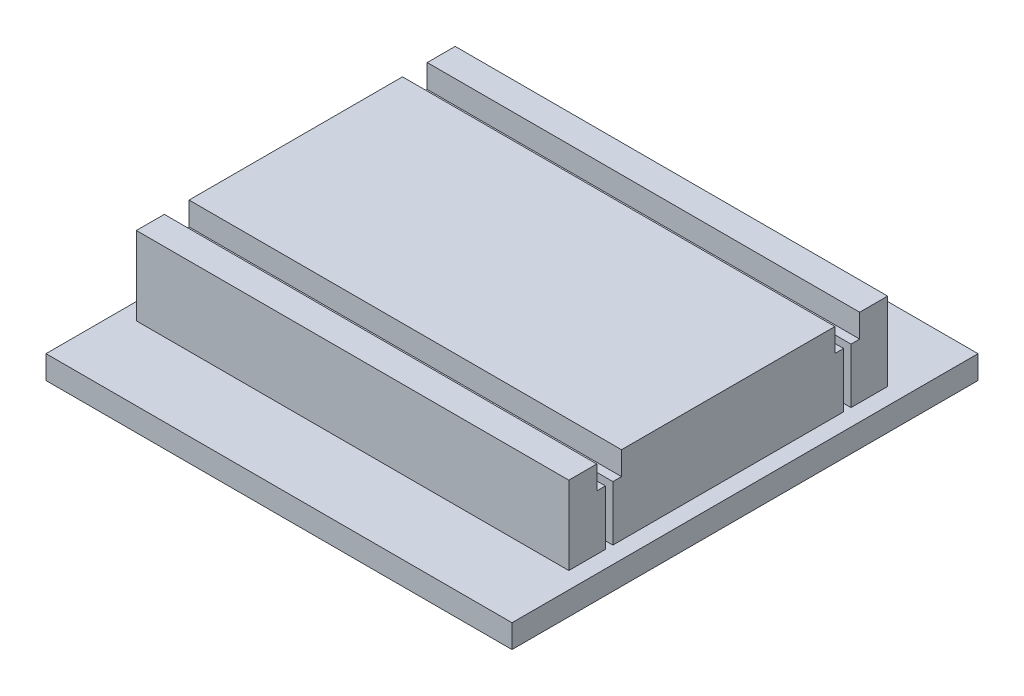
ISO-10303-21;
HEADER;
FILE_DESCRIPTION(('STEP AP214'),'2;1');
FILE_NAME('part.step','',(''),(''),'','','');
FILE_SCHEMA(('AUTOMOTIVE_DESIGN { 1 0 10303 214 1 1 1 1 }'));
ENDSEC;
DATA;
#1=APPLICATION_CONTEXT('core data for automotive mechanical design processes');
#2=APPLICATION_PROTOCOL_DEFINITION('international standard','automotive_design',2000,#1);
#3=PRODUCT_CONTEXT('',#1,'mechanical');
#4=PRODUCT('Part','Part','',(#3));
#5=PRODUCT_RELATED_PRODUCT_CATEGORY('part','',(#4));
#6=PRODUCT_DEFINITION_FORMATION('','',#4);
#7=PRODUCT_DEFINITION_CONTEXT('part definition',#1,'design');
#8=PRODUCT_DEFINITION('design','',#6,#7);
#9=PRODUCT_DEFINITION_SHAPE('','',#8);
#10=(LENGTH_UNIT() NAMED_UNIT(*) SI_UNIT(.MILLI.,.METRE.));
#11=(NAMED_UNIT(*) PLANE_ANGLE_UNIT() SI_UNIT($,.RADIAN.));
#12=(NAMED_UNIT(*) SI_UNIT($,.STERADIAN.) SOLID_ANGLE_UNIT());
#13=UNCERTAINTY_MEASURE_WITH_UNIT(LENGTH_MEASURE(1.E-05),#10,'distance_accuracy_value','');
#14=(GEOMETRIC_REPRESENTATION_CONTEXT(3) GLOBAL_UNCERTAINTY_ASSIGNED_CONTEXT((#13)) GLOBAL_UNIT_ASSIGNED_CONTEXT((#10,
#11,#12)) REPRESENTATION_CONTEXT('',''));
#15=CARTESIAN_POINT('',(0.,0.,0.));
#16=DIRECTION('',(0.,0.,1.));
#17=DIRECTION('',(1.,0.,0.));
#18=AXIS2_PLACEMENT_3D('',#15,#16,#17);
#19=CARTESIAN_POINT('',(0.,0.,0.));
#20=DIRECTION('',(0.,-1.,0.));
#21=DIRECTION('',(0.,0.,-1.));
#22=AXIS2_PLACEMENT_3D('',#19,#20,#21);
#23=PLANE('',#22);
#24=DIRECTION('',(0.,0.,-1.));
#25=VECTOR('',#24,1.);
#26=CARTESIAN_POINT('',(-23.2,0.,0.));
#27=LINE('',#26,#25);
#28=CARTESIAN_POINT('',(-23.2,0.,-13.175));
#29=VERTEX_POINT('',#28);
#30=CARTESIAN_POINT('',(-23.2,0.,-17.105));
#31=VERTEX_POINT('',#30);
#32=EDGE_CURVE('E279',#29,#31,#27,.T.);
#33=ORIENTED_EDGE('',*,*,#32,.T.);
#34=DIRECTION('',(-1.,0.,0.));
#35=VECTOR('',#34,1.);
#36=CARTESIAN_POINT('',(-23.2,0.,-17.105));
#37=LINE('',#36,#35);
#38=CARTESIAN_POINT('',(23.2,0.,-17.105));
#39=VERTEX_POINT('',#38);
#40=EDGE_CURVE('E233',#39,#31,#37,.T.);
#41=ORIENTED_EDGE('',*,*,#40,.F.);
#42=DIRECTION('',(0.,0.,-1.));
#43=VECTOR('',#42,1.);
#44=CARTESIAN_POINT('',(23.2,0.,0.));
#45=LINE('',#44,#43);
#46=CARTESIAN_POINT('',(23.2,0.,-13.175));
#47=VERTEX_POINT('',#46);
#48=EDGE_CURVE('E283',#47,#39,#45,.T.);
#49=ORIENTED_EDGE('',*,*,#48,.F.);
#50=DIRECTION('',(-1.,0.,0.));
#51=VECTOR('',#50,1.);
#52=CARTESIAN_POINT('',(0.,0.,-13.175));
#53=LINE('',#52,#51);
#54=EDGE_CURVE('E277',#47,#29,#53,.T.);
#55=ORIENTED_EDGE('',*,*,#54,.T.);
#56=EDGE_LOOP('',(#33,#41,#49,#55));
#57=FACE_BOUND('',#56,.T.);
#58=DIRECTION('',(0.,0.,1.));
#59=VECTOR('',#58,1.);
#60=CARTESIAN_POINT('',(-23.2,0.,12.375));
#61=LINE('',#60,#59);
#62=CARTESIAN_POINT('',(-23.2,0.,-12.375));
#63=VERTEX_POINT('',#62);
#64=CARTESIAN_POINT('',(-23.2,0.,12.375));
#65=VERTEX_POINT('',#64);
#66=EDGE_CURVE('E355',#63,#65,#61,.T.);
#67=ORIENTED_EDGE('',*,*,#66,.F.);
#68=DIRECTION('',(-1.,0.,0.));
#69=VECTOR('',#68,1.);
#70=CARTESIAN_POINT('',(23.2,0.,-12.375));
#71=LINE('',#70,#69);
#72=CARTESIAN_POINT('',(23.2,0.,-12.375));
#73=VERTEX_POINT('',#72);
#74=EDGE_CURVE('E375',#73,#63,#71,.T.);
#75=ORIENTED_EDGE('',*,*,#74,.F.);
#76=DIRECTION('',(0.,0.,-1.));
#77=VECTOR('',#76,1.);
#78=CARTESIAN_POINT('',(23.2,0.,12.375));
#79=LINE('',#78,#77);
#80=CARTESIAN_POINT('',(23.2,0.,12.375));
#81=VERTEX_POINT('',#80);
#82=EDGE_CURVE('E372',#81,#73,#79,.T.);
#83=ORIENTED_EDGE('',*,*,#82,.F.);
#84=DIRECTION('',(1.,0.,0.));
#85=VECTOR('',#84,1.);
#86=CARTESIAN_POINT('',(23.2,0.,12.375));
#87=LINE('',#86,#85);
#88=EDGE_CURVE('E369',#65,#81,#87,.T.);
#89=ORIENTED_EDGE('',*,*,#88,.F.);
#90=EDGE_LOOP('',(#67,#75,#83,#89));
#91=FACE_BOUND('',#90,.T.);
#92=DIRECTION('',(0.,0.,1.));
#93=VECTOR('',#92,1.);
#94=CARTESIAN_POINT('',(25.,0.,25.));
#95=LINE('',#94,#93);
#96=CARTESIAN_POINT('',(25.,0.,-25.));
#97=VERTEX_POINT('',#96);
#98=CARTESIAN_POINT('',(25.,0.,25.));
#99=VERTEX_POINT('',#98);
#100=EDGE_CURVE('E285',#97,#99,#95,.T.);
#101=ORIENTED_EDGE('',*,*,#100,.F.);
#102=DIRECTION('',(1.,0.,0.));
#103=VECTOR('',#102,1.);
#104=CARTESIAN_POINT('',(-25.,0.,-25.));
#105=LINE('',#104,#103);
#106=CARTESIAN_POINT('',(-25.,0.,-25.));
#107=VERTEX_POINT('',#106);
#108=EDGE_CURVE('E303',#107,#97,#105,.T.);
#109=ORIENTED_EDGE('',*,*,#108,.F.);
#110=DIRECTION('',(0.,0.,-1.));
#111=VECTOR('',#110,1.);
#112=CARTESIAN_POINT('',(-25.,0.,25.));
#113=LINE('',#112,#111);
#114=CARTESIAN_POINT('',(-25.,0.,25.));
#115=VERTEX_POINT('',#114);
#116=EDGE_CURVE('E314',#115,#107,#113,.T.);
#117=ORIENTED_EDGE('',*,*,#116,.F.);
#118=DIRECTION('',(-1.,0.,0.));
#119=VECTOR('',#118,1.);
#120=CARTESIAN_POINT('',(-25.,0.,25.));
#121=LINE('',#120,#119);
#122=EDGE_CURVE('E312',#99,#115,#121,.T.);
#123=ORIENTED_EDGE('',*,*,#122,.F.);
#124=EDGE_LOOP('',(#101,#109,#117,#123));
#125=FACE_BOUND('',#124,.T.);
#126=DIRECTION('',(0.,0.,1.));
#127=VECTOR('',#126,1.);
#128=CARTESIAN_POINT('',(23.2,0.,0.));
#129=LINE('',#128,#127);
#130=CARTESIAN_POINT('',(23.2,0.,13.175));
#131=VERTEX_POINT('',#130);
#132=CARTESIAN_POINT('',(23.2,0.,17.105));
#133=VERTEX_POINT('',#132);
#134=EDGE_CURVE('E50',#131,#133,#129,.T.);
#135=ORIENTED_EDGE('',*,*,#134,.T.);
#136=DIRECTION('',(1.,0.,0.));
#137=VECTOR('',#136,1.);
#138=CARTESIAN_POINT('',(23.2,0.,17.105));
#139=LINE('',#138,#137);
#140=CARTESIAN_POINT('',(-23.2,0.,17.105));
#141=VERTEX_POINT('',#140);
#142=EDGE_CURVE('E204',#141,#133,#139,.T.);
#143=ORIENTED_EDGE('',*,*,#142,.F.);
#144=DIRECTION('',(0.,0.,1.));
#145=VECTOR('',#144,1.);
#146=CARTESIAN_POINT('',(-23.2,0.,0.));
#147=LINE('',#146,#145);
#148=CARTESIAN_POINT('',(-23.2,0.,13.175));
#149=VERTEX_POINT('',#148);
#150=EDGE_CURVE('E58',#149,#141,#147,.T.);
#151=ORIENTED_EDGE('',*,*,#150,.F.);
#152=DIRECTION('',(-1.,0.,0.));
#153=VECTOR('',#152,1.);
#154=CARTESIAN_POINT('',(0.,0.,13.175));
#155=LINE('',#154,#153);
#156=EDGE_CURVE('E259',#131,#149,#155,.T.);
#157=ORIENTED_EDGE('',*,*,#156,.F.);
#158=EDGE_LOOP('',(#135,#143,#151,#157));
#159=FACE_BOUND('',#158,.T.);
#160=ADVANCED_FACE('F35',(#57,#91,#125,#159),#23,.F.);
#161=CARTESIAN_POINT('',(0.,5.9,0.));
#162=DIRECTION('',(0.,1.,0.));
#163=DIRECTION('',(0.,0.,1.));
#164=AXIS2_PLACEMENT_3D('',#161,#162,#163);
#165=PLANE('',#164);
#166=DIRECTION('',(0.,0.,-1.));
#167=VECTOR('',#166,1.);
#168=CARTESIAN_POINT('',(23.2,5.9,12.375));
#169=LINE('',#168,#167);
#170=CARTESIAN_POINT('',(23.2,5.9,12.375));
#171=VERTEX_POINT('',#170);
#172=CARTESIAN_POINT('',(23.2,5.9,11.45));
#173=VERTEX_POINT('',#172);
#174=EDGE_CURVE('E362',#171,#173,#169,.T.);
#175=ORIENTED_EDGE('',*,*,#174,.T.);
#176=DIRECTION('',(-1.,0.,0.));
#177=VECTOR('',#176,1.);
#178=CARTESIAN_POINT('',(0.,5.9,11.45));
#179=LINE('',#178,#177);
#180=CARTESIAN_POINT('',(-23.2,5.9,11.45));
#181=VERTEX_POINT('',#180);
#182=EDGE_CURVE('E333',#173,#181,#179,.T.);
#183=ORIENTED_EDGE('',*,*,#182,.T.);
#184=DIRECTION('',(0.,0.,1.));
#185=VECTOR('',#184,1.);
#186=CARTESIAN_POINT('',(-23.2,5.9,12.375));
#187=LINE('',#186,#185);
#188=CARTESIAN_POINT('',(-23.2,5.9,12.375));
#189=VERTEX_POINT('',#188);
#190=EDGE_CURVE('E359',#181,#189,#187,.T.);
#191=ORIENTED_EDGE('',*,*,#190,.T.);
#192=DIRECTION('',(1.,0.,0.));
#193=VECTOR('',#192,1.);
#194=CARTESIAN_POINT('',(23.2,5.9,12.375));
#195=LINE('',#194,#193);
#196=EDGE_CURVE('E358',#189,#171,#195,.T.);
#197=ORIENTED_EDGE('',*,*,#196,.T.);
#198=EDGE_LOOP('',(#175,#183,#191,#197));
#199=FACE_BOUND('',#198,.T.);
#200=ADVANCED_FACE('F418',(#199),#165,.T.);
#201=CARTESIAN_POINT('',(-23.2,5.9,12.375));
#202=DIRECTION('',(1.,0.,0.));
#203=DIRECTION('',(0.,0.,-1.));
#204=AXIS2_PLACEMENT_3D('',#201,#202,#203);
#205=PLANE('',#204);
#206=ORIENTED_EDGE('',*,*,#66,.T.);
#207=DIRECTION('',(0.,-1.,0.));
#208=VECTOR('',#207,1.);
#209=CARTESIAN_POINT('',(-23.2,5.9,12.375));
#210=LINE('',#209,#208);
#211=EDGE_CURVE('E11',#189,#65,#210,.T.);
#212=ORIENTED_EDGE('',*,*,#211,.F.);
#213=ORIENTED_EDGE('',*,*,#190,.F.);
#214=DIRECTION('',(0.,-1.,0.));
#215=VECTOR('',#214,1.);
#216=CARTESIAN_POINT('',(-23.2,8.4,11.45));
#217=LINE('',#216,#215);
#218=CARTESIAN_POINT('',(-23.2,8.4,11.45));
#219=VERTEX_POINT('',#218);
#220=EDGE_CURVE('E346',#219,#181,#217,.T.);
#221=ORIENTED_EDGE('',*,*,#220,.F.);
#222=DIRECTION('',(0.,0.,1.));
#223=VECTOR('',#222,1.);
#224=CARTESIAN_POINT('',(-23.2,8.4,0.));
#225=LINE('',#224,#223);
#226=CARTESIAN_POINT('',(-23.2,8.4,-11.45));
#227=VERTEX_POINT('',#226);
#228=EDGE_CURVE('E335',#227,#219,#225,.T.);
#229=ORIENTED_EDGE('',*,*,#228,.F.);
#230=DIRECTION('',(0.,-1.,0.));
#231=VECTOR('',#230,1.);
#232=CARTESIAN_POINT('',(-23.2,8.4,-11.45));
#233=LINE('',#232,#231);
#234=CARTESIAN_POINT('',(-23.2,5.9,-11.45));
#235=VERTEX_POINT('',#234);
#236=EDGE_CURVE('E349',#227,#235,#233,.T.);
#237=ORIENTED_EDGE('',*,*,#236,.T.);
#238=CARTESIAN_POINT('',(-23.2,5.9,-12.375));
#239=VERTEX_POINT('',#238);
#240=EDGE_CURVE('E356',#239,#235,#187,.T.);
#241=ORIENTED_EDGE('',*,*,#240,.F.);
#242=DIRECTION('',(0.,-1.,0.));
#243=VECTOR('',#242,1.);
#244=CARTESIAN_POINT('',(-23.2,5.9,-12.375));
#245=LINE('',#244,#243);
#246=EDGE_CURVE('E366',#239,#63,#245,.T.);
#247=ORIENTED_EDGE('',*,*,#246,.T.);
#248=EDGE_LOOP('',(#206,#212,#213,#221,#229,#237,#241,#247));
#249=FACE_BOUND('',#248,.T.);
#250=ADVANCED_FACE('F37',(#249),#205,.F.);
#251=CARTESIAN_POINT('',(23.2,5.9,12.375));
#252=DIRECTION('',(0.,0.,-1.));
#253=DIRECTION('',(-1.,0.,0.));
#254=AXIS2_PLACEMENT_3D('',#251,#252,#253);
#255=PLANE('',#254);
#256=ORIENTED_EDGE('',*,*,#88,.T.);
#257=DIRECTION('',(0.,-1.,0.));
#258=VECTOR('',#257,1.);
#259=CARTESIAN_POINT('',(23.2,5.9,12.375));
#260=LINE('',#259,#258);
#261=EDGE_CURVE('E43',#171,#81,#260,.T.);
#262=ORIENTED_EDGE('',*,*,#261,.F.);
#263=ORIENTED_EDGE('',*,*,#196,.F.);
#264=ORIENTED_EDGE('',*,*,#211,.T.);
#265=EDGE_LOOP('',(#256,#262,#263,#264));
#266=FACE_BOUND('',#265,.T.);
#267=ADVANCED_FACE('F390',(#266),#255,.F.);
#268=CARTESIAN_POINT('',(23.2,5.9,12.375));
#269=DIRECTION('',(-1.,0.,0.));
#270=DIRECTION('',(0.,0.,1.));
#271=AXIS2_PLACEMENT_3D('',#268,#269,#270);
#272=PLANE('',#271);
#273=ORIENTED_EDGE('',*,*,#82,.T.);
#274=DIRECTION('',(0.,-1.,0.));
#275=VECTOR('',#274,1.);
#276=CARTESIAN_POINT('',(23.2,5.9,-12.375));
#277=LINE('',#276,#275);
#278=CARTESIAN_POINT('',(23.2,5.9,-12.375));
#279=VERTEX_POINT('',#278);
#280=EDGE_CURVE('E380',#279,#73,#277,.T.);
#281=ORIENTED_EDGE('',*,*,#280,.F.);
#282=CARTESIAN_POINT('',(23.2,5.9,-11.45));
#283=VERTEX_POINT('',#282);
#284=EDGE_CURVE('E361',#283,#279,#169,.T.);
#285=ORIENTED_EDGE('',*,*,#284,.F.);
#286=DIRECTION('',(0.,-1.,0.));
#287=VECTOR('',#286,1.);
#288=CARTESIAN_POINT('',(23.2,8.4,-11.45));
#289=LINE('',#288,#287);
#290=CARTESIAN_POINT('',(23.2,8.4,-11.45));
#291=VERTEX_POINT('',#290);
#292=EDGE_CURVE('E352',#291,#283,#289,.T.);
#293=ORIENTED_EDGE('',*,*,#292,.F.);
#294=DIRECTION('',(0.,0.,-1.));
#295=VECTOR('',#294,1.);
#296=CARTESIAN_POINT('',(23.2,8.4,0.));
#297=LINE('',#296,#295);
#298=CARTESIAN_POINT('',(23.2,8.4,11.45));
#299=VERTEX_POINT('',#298);
#300=EDGE_CURVE('E329',#299,#291,#297,.T.);
#301=ORIENTED_EDGE('',*,*,#300,.F.);
#302=DIRECTION('',(0.,-1.,0.));
#303=VECTOR('',#302,1.);
#304=CARTESIAN_POINT('',(23.2,8.4,11.45));
#305=LINE('',#304,#303);
#306=EDGE_CURVE('E340',#299,#173,#305,.T.);
#307=ORIENTED_EDGE('',*,*,#306,.T.);
#308=ORIENTED_EDGE('',*,*,#174,.F.);
#309=ORIENTED_EDGE('',*,*,#261,.T.);
#310=EDGE_LOOP('',(#273,#281,#285,#293,#301,#307,#308,#309));
#311=FACE_BOUND('',#310,.T.);
#312=ADVANCED_FACE('F386',(#311),#272,.F.);
#313=CARTESIAN_POINT('',(23.2,5.9,-12.375));
#314=DIRECTION('',(0.,0.,1.));
#315=DIRECTION('',(1.,0.,0.));
#316=AXIS2_PLACEMENT_3D('',#313,#314,#315);
#317=PLANE('',#316);
#318=ORIENTED_EDGE('',*,*,#74,.T.);
#319=ORIENTED_EDGE('',*,*,#246,.F.);
#320=DIRECTION('',(-1.,0.,0.));
#321=VECTOR('',#320,1.);
#322=CARTESIAN_POINT('',(23.2,5.9,-12.375));
#323=LINE('',#322,#321);
#324=EDGE_CURVE('E364',#279,#239,#323,.T.);
#325=ORIENTED_EDGE('',*,*,#324,.F.);
#326=ORIENTED_EDGE('',*,*,#280,.T.);
#327=EDGE_LOOP('',(#318,#319,#325,#326));
#328=FACE_BOUND('',#327,.T.);
#329=ADVANCED_FACE('F396',(#328),#317,.F.);
#330=DIRECTION('',(-1.,0.,0.));
#331=VECTOR('',#330,1.);
#332=CARTESIAN_POINT('',(0.,5.9,-11.45));
#333=LINE('',#332,#331);
#334=EDGE_CURVE('E328',#283,#235,#333,.T.);
#335=ORIENTED_EDGE('',*,*,#334,.F.);
#336=ORIENTED_EDGE('',*,*,#284,.T.);
#337=ORIENTED_EDGE('',*,*,#324,.T.);
#338=ORIENTED_EDGE('',*,*,#240,.T.);
#339=EDGE_LOOP('',(#335,#336,#337,#338));
#340=FACE_BOUND('',#339,.T.);
#341=ADVANCED_FACE('F403',(#340),#165,.T.);
#342=CARTESIAN_POINT('',(0.,8.4,-11.45));
#343=DIRECTION('',(0.,0.,1.));
#344=DIRECTION('',(1.,0.,0.));
#345=AXIS2_PLACEMENT_3D('',#342,#343,#344);
#346=PLANE('',#345);
#347=ORIENTED_EDGE('',*,*,#334,.T.);
#348=ORIENTED_EDGE('',*,*,#236,.F.);
#349=DIRECTION('',(-1.,0.,0.));
#350=VECTOR('',#349,1.);
#351=CARTESIAN_POINT('',(0.,8.4,-11.45));
#352=LINE('',#351,#350);
#353=EDGE_CURVE('E332',#291,#227,#352,.T.);
#354=ORIENTED_EDGE('',*,*,#353,.F.);
#355=ORIENTED_EDGE('',*,*,#292,.T.);
#356=EDGE_LOOP('',(#347,#348,#354,#355));
#357=FACE_BOUND('',#356,.T.);
#358=ADVANCED_FACE('F406',(#357),#346,.F.);
#359=CARTESIAN_POINT('',(0.,8.4,11.45));
#360=DIRECTION('',(0.,0.,1.));
#361=DIRECTION('',(1.,0.,0.));
#362=AXIS2_PLACEMENT_3D('',#359,#360,#361);
#363=PLANE('',#362);
#364=ORIENTED_EDGE('',*,*,#182,.F.);
#365=ORIENTED_EDGE('',*,*,#306,.F.);
#366=DIRECTION('',(-1.,0.,0.));
#367=VECTOR('',#366,1.);
#368=CARTESIAN_POINT('',(0.,8.4,11.45));
#369=LINE('',#368,#367);
#370=EDGE_CURVE('E337',#299,#219,#369,.T.);
#371=ORIENTED_EDGE('',*,*,#370,.T.);
#372=ORIENTED_EDGE('',*,*,#220,.T.);
#373=EDGE_LOOP('',(#364,#365,#371,#372));
#374=FACE_BOUND('',#373,.T.);
#375=ADVANCED_FACE('F415',(#374),#363,.T.);
#376=CARTESIAN_POINT('',(0.,8.4,0.));
#377=DIRECTION('',(0.,1.,0.));
#378=DIRECTION('',(0.,0.,1.));
#379=AXIS2_PLACEMENT_3D('',#376,#377,#378);
#380=PLANE('',#379);
#381=ORIENTED_EDGE('',*,*,#300,.T.);
#382=ORIENTED_EDGE('',*,*,#353,.T.);
#383=ORIENTED_EDGE('',*,*,#228,.T.);
#384=ORIENTED_EDGE('',*,*,#370,.F.);
#385=EDGE_LOOP('',(#381,#382,#383,#384));
#386=FACE_BOUND('',#385,.T.);
#387=ADVANCED_FACE('F412',(#386),#380,.T.);
#388=CARTESIAN_POINT('',(25.,-2.5,25.));
#389=DIRECTION('',(-1.,0.,0.));
#390=DIRECTION('',(0.,0.,1.));
#391=AXIS2_PLACEMENT_3D('',#388,#389,#390);
#392=PLANE('',#391);
#393=ORIENTED_EDGE('',*,*,#100,.T.);
#394=DIRECTION('',(0.,1.,0.));
#395=VECTOR('',#394,1.);
#396=CARTESIAN_POINT('',(25.,-2.5,25.));
#397=LINE('',#396,#395);
#398=CARTESIAN_POINT('',(25.,-2.5,25.));
#399=VERTEX_POINT('',#398);
#400=EDGE_CURVE('E325',#399,#99,#397,.T.);
#401=ORIENTED_EDGE('',*,*,#400,.F.);
#402=DIRECTION('',(0.,0.,1.));
#403=VECTOR('',#402,1.);
#404=CARTESIAN_POINT('',(25.,-2.5,25.));
#405=LINE('',#404,#403);
#406=CARTESIAN_POINT('',(25.,-2.5,-25.));
#407=VERTEX_POINT('',#406);
#408=EDGE_CURVE('E299',#407,#399,#405,.T.);
#409=ORIENTED_EDGE('',*,*,#408,.F.);
#410=DIRECTION('',(0.,1.,0.));
#411=VECTOR('',#410,1.);
#412=CARTESIAN_POINT('',(25.,-2.5,-25.));
#413=LINE('',#412,#411);
#414=EDGE_CURVE('E309',#407,#97,#413,.T.);
#415=ORIENTED_EDGE('',*,*,#414,.T.);
#416=EDGE_LOOP('',(#393,#401,#409,#415));
#417=FACE_BOUND('',#416,.T.);
#418=ADVANCED_FACE('F460',(#417),#392,.F.);
#419=CARTESIAN_POINT('',(-25.,-2.5,25.));
#420=DIRECTION('',(0.,0.,-1.));
#421=DIRECTION('',(-1.,0.,0.));
#422=AXIS2_PLACEMENT_3D('',#419,#420,#421);
#423=PLANE('',#422);
#424=ORIENTED_EDGE('',*,*,#122,.T.);
#425=DIRECTION('',(0.,1.,0.));
#426=VECTOR('',#425,1.);
#427=CARTESIAN_POINT('',(-25.,-2.5,25.));
#428=LINE('',#427,#426);
#429=CARTESIAN_POINT('',(-25.,-2.5,25.));
#430=VERTEX_POINT('',#429);
#431=EDGE_CURVE('E322',#430,#115,#428,.T.);
#432=ORIENTED_EDGE('',*,*,#431,.F.);
#433=DIRECTION('',(-1.,0.,0.));
#434=VECTOR('',#433,1.);
#435=CARTESIAN_POINT('',(-25.,-2.5,25.));
#436=LINE('',#435,#434);
#437=EDGE_CURVE('E302',#399,#430,#436,.T.);
#438=ORIENTED_EDGE('',*,*,#437,.F.);
#439=ORIENTED_EDGE('',*,*,#400,.T.);
#440=EDGE_LOOP('',(#424,#432,#438,#439));
#441=FACE_BOUND('',#440,.T.);
#442=ADVANCED_FACE('F465',(#441),#423,.F.);
#443=CARTESIAN_POINT('',(-25.,-2.5,25.));
#444=DIRECTION('',(1.,0.,0.));
#445=DIRECTION('',(0.,0.,-1.));
#446=AXIS2_PLACEMENT_3D('',#443,#444,#445);
#447=PLANE('',#446);
#448=ORIENTED_EDGE('',*,*,#116,.T.);
#449=DIRECTION('',(0.,1.,0.));
#450=VECTOR('',#449,1.);
#451=CARTESIAN_POINT('',(-25.,-2.5,-25.));
#452=LINE('',#451,#450);
#453=CARTESIAN_POINT('',(-25.,-2.5,-25.));
#454=VERTEX_POINT('',#453);
#455=EDGE_CURVE('E319',#454,#107,#452,.T.);
#456=ORIENTED_EDGE('',*,*,#455,.F.);
#457=DIRECTION('',(0.,0.,-1.));
#458=VECTOR('',#457,1.);
#459=CARTESIAN_POINT('',(-25.,-2.5,25.));
#460=LINE('',#459,#458);
#461=EDGE_CURVE('E305',#430,#454,#460,.T.);
#462=ORIENTED_EDGE('',*,*,#461,.F.);
#463=ORIENTED_EDGE('',*,*,#431,.T.);
#464=EDGE_LOOP('',(#448,#456,#462,#463));
#465=FACE_BOUND('',#464,.T.);
#466=ADVANCED_FACE('F477',(#465),#447,.F.);
#467=CARTESIAN_POINT('',(-25.,-2.5,-25.));
#468=DIRECTION('',(0.,0.,1.));
#469=DIRECTION('',(1.,0.,0.));
#470=AXIS2_PLACEMENT_3D('',#467,#468,#469);
#471=PLANE('',#470);
#472=ORIENTED_EDGE('',*,*,#108,.T.);
#473=ORIENTED_EDGE('',*,*,#414,.F.);
#474=DIRECTION('',(1.,0.,0.));
#475=VECTOR('',#474,1.);
#476=CARTESIAN_POINT('',(-25.,-2.5,-25.));
#477=LINE('',#476,#475);
#478=EDGE_CURVE('E307',#454,#407,#477,.T.);
#479=ORIENTED_EDGE('',*,*,#478,.F.);
#480=ORIENTED_EDGE('',*,*,#455,.T.);
#481=EDGE_LOOP('',(#472,#473,#479,#480));
#482=FACE_BOUND('',#481,.T.);
#483=ADVANCED_FACE('F487',(#482),#471,.F.);
#484=CARTESIAN_POINT('',(0.,-2.5,0.));
#485=DIRECTION('',(0.,-1.,0.));
#486=DIRECTION('',(0.,0.,-1.));
#487=AXIS2_PLACEMENT_3D('',#484,#485,#486);
#488=PLANE('',#487);
#489=ORIENTED_EDGE('',*,*,#408,.T.);
#490=ORIENTED_EDGE('',*,*,#437,.T.);
#491=ORIENTED_EDGE('',*,*,#461,.T.);
#492=ORIENTED_EDGE('',*,*,#478,.T.);
#493=EDGE_LOOP('',(#489,#490,#491,#492));
#494=FACE_BOUND('',#493,.T.);
#495=ADVANCED_FACE('F497',(#494),#488,.T.);
#496=CARTESIAN_POINT('',(0.,5.9,0.));
#497=DIRECTION('',(0.,1.,0.));
#498=DIRECTION('',(0.,0.,1.));
#499=AXIS2_PLACEMENT_3D('',#496,#497,#498);
#500=PLANE('',#499);
#501=DIRECTION('',(-1.,0.,0.));
#502=VECTOR('',#501,1.);
#503=CARTESIAN_POINT('',(0.,5.9,-13.175));
#504=LINE('',#503,#502);
#505=CARTESIAN_POINT('',(23.2,5.9,-13.175));
#506=VERTEX_POINT('',#505);
#507=CARTESIAN_POINT('',(-23.2,5.9,-13.175));
#508=VERTEX_POINT('',#507);
#509=EDGE_CURVE('E282',#506,#508,#504,.T.);
#510=ORIENTED_EDGE('',*,*,#509,.F.);
#511=DIRECTION('',(0.,0.,-1.));
#512=VECTOR('',#511,1.);
#513=CARTESIAN_POINT('',(23.2,5.9,0.));
#514=LINE('',#513,#512);
#515=CARTESIAN_POINT('',(23.2,5.9,-14.105));
#516=VERTEX_POINT('',#515);
#517=EDGE_CURVE('E273',#506,#516,#514,.T.);
#518=ORIENTED_EDGE('',*,*,#517,.T.);
#519=DIRECTION('',(-1.,0.,0.));
#520=VECTOR('',#519,1.);
#521=CARTESIAN_POINT('',(0.,5.9,-14.105));
#522=LINE('',#521,#520);
#523=CARTESIAN_POINT('',(-23.2,5.9,-14.105));
#524=VERTEX_POINT('',#523);
#525=EDGE_CURVE('E280',#516,#524,#522,.T.);
#526=ORIENTED_EDGE('',*,*,#525,.T.);
#527=DIRECTION('',(0.,0.,-1.));
#528=VECTOR('',#527,1.);
#529=CARTESIAN_POINT('',(-23.2,5.9,0.));
#530=LINE('',#529,#528);
#531=EDGE_CURVE('E292',#508,#524,#530,.T.);
#532=ORIENTED_EDGE('',*,*,#531,.F.);
#533=EDGE_LOOP('',(#510,#518,#526,#532));
#534=FACE_BOUND('',#533,.T.);
#535=ADVANCED_FACE('F507',(#534),#500,.T.);
#536=CARTESIAN_POINT('',(0.,52.3093191072655,-13.175));
#537=DIRECTION('',(0.,0.,1.));
#538=DIRECTION('',(1.,0.,0.));
#539=AXIS2_PLACEMENT_3D('',#536,#537,#538);
#540=PLANE('',#539);
#541=DIRECTION('',(0.,-1.,0.));
#542=VECTOR('',#541,1.);
#543=CARTESIAN_POINT('',(23.2,52.3093191072655,-13.175));
#544=LINE('',#543,#542);
#545=EDGE_CURVE('E286',#506,#47,#544,.T.);
#546=ORIENTED_EDGE('',*,*,#545,.F.);
#547=ORIENTED_EDGE('',*,*,#509,.T.);
#548=DIRECTION('',(0.,-1.,0.));
#549=VECTOR('',#548,1.);
#550=CARTESIAN_POINT('',(-23.2,52.3093191072655,-13.175));
#551=LINE('',#550,#549);
#552=EDGE_CURVE('E289',#508,#29,#551,.T.);
#553=ORIENTED_EDGE('',*,*,#552,.T.);
#554=ORIENTED_EDGE('',*,*,#54,.F.);
#555=EDGE_LOOP('',(#546,#547,#553,#554));
#556=FACE_BOUND('',#555,.T.);
#557=ADVANCED_FACE('F515',(#556),#540,.T.);
#558=CARTESIAN_POINT('',(-23.2,52.3093191072655,0.));
#559=DIRECTION('',(-1.,0.,0.));
#560=DIRECTION('',(0.,0.,1.));
#561=AXIS2_PLACEMENT_3D('',#558,#559,#560);
#562=PLANE('',#561);
#563=ORIENTED_EDGE('',*,*,#552,.F.);
#564=ORIENTED_EDGE('',*,*,#531,.T.);
#565=DIRECTION('',(0.,-1.,0.));
#566=VECTOR('',#565,1.);
#567=CARTESIAN_POINT('',(-23.2,54.8968816158675,-14.105));
#568=LINE('',#567,#566);
#569=CARTESIAN_POINT('',(-23.2,8.4,-14.105));
#570=VERTEX_POINT('',#569);
#571=EDGE_CURVE('E222',#570,#524,#568,.T.);
#572=ORIENTED_EDGE('',*,*,#571,.F.);
#573=DIRECTION('',(0.,0.,1.));
#574=VECTOR('',#573,1.);
#575=CARTESIAN_POINT('',(-23.2,8.4,-14.105));
#576=LINE('',#575,#574);
#577=CARTESIAN_POINT('',(-23.2,8.4,-17.105));
#578=VERTEX_POINT('',#577);
#579=EDGE_CURVE('E245',#578,#570,#576,.T.);
#580=ORIENTED_EDGE('',*,*,#579,.F.);
#581=DIRECTION('',(0.,-1.,0.));
#582=VECTOR('',#581,1.);
#583=CARTESIAN_POINT('',(-23.2,54.8968816158675,-17.105));
#584=LINE('',#583,#582);
#585=EDGE_CURVE('E219',#578,#31,#584,.T.);
#586=ORIENTED_EDGE('',*,*,#585,.T.);
#587=ORIENTED_EDGE('',*,*,#32,.F.);
#588=EDGE_LOOP('',(#563,#564,#572,#580,#586,#587));
#589=FACE_BOUND('',#588,.T.);
#590=ADVANCED_FACE('F520',(#589),#562,.T.);
#591=CARTESIAN_POINT('',(23.2,52.3093191072655,0.));
#592=DIRECTION('',(-1.,0.,0.));
#593=DIRECTION('',(0.,0.,1.));
#594=AXIS2_PLACEMENT_3D('',#591,#592,#593);
#595=PLANE('',#594);
#596=ORIENTED_EDGE('',*,*,#517,.F.);
#597=ORIENTED_EDGE('',*,*,#545,.T.);
#598=ORIENTED_EDGE('',*,*,#48,.T.);
#599=DIRECTION('',(0.,-1.,0.));
#600=VECTOR('',#599,1.);
#601=CARTESIAN_POINT('',(23.2,54.8968816158675,-17.105));
#602=LINE('',#601,#600);
#603=CARTESIAN_POINT('',(23.2,8.4,-17.105));
#604=VERTEX_POINT('',#603);
#605=EDGE_CURVE('E237',#604,#39,#602,.T.);
#606=ORIENTED_EDGE('',*,*,#605,.F.);
#607=DIRECTION('',(0.,0.,-1.));
#608=VECTOR('',#607,1.);
#609=CARTESIAN_POINT('',(23.2,8.4,-14.105));
#610=LINE('',#609,#608);
#611=CARTESIAN_POINT('',(23.2,8.4,-14.105));
#612=VERTEX_POINT('',#611);
#613=EDGE_CURVE('E238',#612,#604,#610,.T.);
#614=ORIENTED_EDGE('',*,*,#613,.F.);
#615=DIRECTION('',(0.,-1.,0.));
#616=VECTOR('',#615,1.);
#617=CARTESIAN_POINT('',(23.2,54.8968816158675,-14.105));
#618=LINE('',#617,#616);
#619=EDGE_CURVE('E252',#612,#516,#618,.T.);
#620=ORIENTED_EDGE('',*,*,#619,.T.);
#621=EDGE_LOOP('',(#596,#597,#598,#606,#614,#620));
#622=FACE_BOUND('',#621,.T.);
#623=ADVANCED_FACE('F554',(#622),#595,.F.);
#624=CARTESIAN_POINT('',(23.2,52.3093191072655,0.));
#625=DIRECTION('',(1.,0.,0.));
#626=DIRECTION('',(0.,0.,-1.));
#627=AXIS2_PLACEMENT_3D('',#624,#625,#626);
#628=PLANE('',#627);
#629=DIRECTION('',(0.,-1.,0.));
#630=VECTOR('',#629,1.);
#631=CARTESIAN_POINT('',(23.2,52.3093191072655,13.175));
#632=LINE('',#631,#630);
#633=CARTESIAN_POINT('',(23.2,5.9,13.175));
#634=VERTEX_POINT('',#633);
#635=EDGE_CURVE('E262',#634,#131,#632,.T.);
#636=ORIENTED_EDGE('',*,*,#635,.F.);
#637=DIRECTION('',(0.,0.,1.));
#638=VECTOR('',#637,1.);
#639=CARTESIAN_POINT('',(23.2,5.9,0.));
#640=LINE('',#639,#638);
#641=CARTESIAN_POINT('',(23.2,5.9,14.105));
#642=VERTEX_POINT('',#641);
#643=EDGE_CURVE('E268',#634,#642,#640,.T.);
#644=ORIENTED_EDGE('',*,*,#643,.T.);
#645=DIRECTION('',(0.,-1.,0.));
#646=VECTOR('',#645,1.);
#647=CARTESIAN_POINT('',(23.2,54.8968816158675,14.105));
#648=LINE('',#647,#646);
#649=CARTESIAN_POINT('',(23.2,8.4,14.105));
#650=VERTEX_POINT('',#649);
#651=EDGE_CURVE('E228',#650,#642,#648,.T.);
#652=ORIENTED_EDGE('',*,*,#651,.F.);
#653=DIRECTION('',(0.,0.,-1.));
#654=VECTOR('',#653,1.);
#655=CARTESIAN_POINT('',(23.2,8.4,14.105));
#656=LINE('',#655,#654);
#657=CARTESIAN_POINT('',(23.2,8.4,17.105));
#658=VERTEX_POINT('',#657);
#659=EDGE_CURVE('E214',#658,#650,#656,.T.);
#660=ORIENTED_EDGE('',*,*,#659,.F.);
#661=DIRECTION('',(0.,-1.,0.));
#662=VECTOR('',#661,1.);
#663=CARTESIAN_POINT('',(23.2,54.8968816158675,17.105));
#664=LINE('',#663,#662);
#665=EDGE_CURVE('E210',#658,#133,#664,.T.);
#666=ORIENTED_EDGE('',*,*,#665,.T.);
#667=ORIENTED_EDGE('',*,*,#134,.F.);
#668=EDGE_LOOP('',(#636,#644,#652,#660,#666,#667));
#669=FACE_BOUND('',#668,.T.);
#670=ADVANCED_FACE('F534',(#669),#628,.T.);
#671=CARTESIAN_POINT('',(0.,52.3093191072655,13.175));
#672=DIRECTION('',(0.,0.,1.));
#673=DIRECTION('',(1.,0.,0.));
#674=AXIS2_PLACEMENT_3D('',#671,#672,#673);
#675=PLANE('',#674);
#676=DIRECTION('',(-1.,0.,0.));
#677=VECTOR('',#676,1.);
#678=CARTESIAN_POINT('',(0.,5.9,13.175));
#679=LINE('',#678,#677);
#680=CARTESIAN_POINT('',(-23.2,5.9,13.175));
#681=VERTEX_POINT('',#680);
#682=EDGE_CURVE('E264',#634,#681,#679,.T.);
#683=ORIENTED_EDGE('',*,*,#682,.F.);
#684=ORIENTED_EDGE('',*,*,#635,.T.);
#685=ORIENTED_EDGE('',*,*,#156,.T.);
#686=DIRECTION('',(0.,-1.,0.));
#687=VECTOR('',#686,1.);
#688=CARTESIAN_POINT('',(-23.2,52.3093191072655,13.175));
#689=LINE('',#688,#687);
#690=EDGE_CURVE('E258',#681,#149,#689,.T.);
#691=ORIENTED_EDGE('',*,*,#690,.F.);
#692=EDGE_LOOP('',(#683,#684,#685,#691));
#693=FACE_BOUND('',#692,.T.);
#694=ADVANCED_FACE('F529',(#693),#675,.F.);
#695=CARTESIAN_POINT('',(-23.2,52.3093191072655,0.));
#696=DIRECTION('',(1.,0.,0.));
#697=DIRECTION('',(0.,0.,-1.));
#698=AXIS2_PLACEMENT_3D('',#695,#696,#697);
#699=PLANE('',#698);
#700=DIRECTION('',(0.,0.,1.));
#701=VECTOR('',#700,1.);
#702=CARTESIAN_POINT('',(-23.2,5.9,0.));
#703=LINE('',#702,#701);
#704=CARTESIAN_POINT('',(-23.2,5.9,14.105));
#705=VERTEX_POINT('',#704);
#706=EDGE_CURVE('E267',#681,#705,#703,.T.);
#707=ORIENTED_EDGE('',*,*,#706,.F.);
#708=ORIENTED_EDGE('',*,*,#690,.T.);
#709=ORIENTED_EDGE('',*,*,#150,.T.);
#710=DIRECTION('',(0.,-1.,0.));
#711=VECTOR('',#710,1.);
#712=CARTESIAN_POINT('',(-23.2,54.8968816158675,17.105));
#713=LINE('',#712,#711);
#714=CARTESIAN_POINT('',(-23.2,8.4,17.105));
#715=VERTEX_POINT('',#714);
#716=EDGE_CURVE('E194',#715,#141,#713,.T.);
#717=ORIENTED_EDGE('',*,*,#716,.F.);
#718=DIRECTION('',(0.,0.,1.));
#719=VECTOR('',#718,1.);
#720=CARTESIAN_POINT('',(-23.2,8.4,14.105));
#721=LINE('',#720,#719);
#722=CARTESIAN_POINT('',(-23.2,8.4,14.105));
#723=VERTEX_POINT('',#722);
#724=EDGE_CURVE('E200',#723,#715,#721,.T.);
#725=ORIENTED_EDGE('',*,*,#724,.F.);
#726=DIRECTION('',(0.,-1.,0.));
#727=VECTOR('',#726,1.);
#728=CARTESIAN_POINT('',(-23.2,54.8968816158675,14.105));
#729=LINE('',#728,#727);
#730=EDGE_CURVE('E205',#723,#705,#729,.T.);
#731=ORIENTED_EDGE('',*,*,#730,.T.);
#732=EDGE_LOOP('',(#707,#708,#709,#717,#725,#731));
#733=FACE_BOUND('',#732,.T.);
#734=ADVANCED_FACE('F197',(#733),#699,.F.);
#735=CARTESIAN_POINT('',(0.,5.9,0.));
#736=DIRECTION('',(0.,1.,0.));
#737=DIRECTION('',(0.,0.,1.));
#738=AXIS2_PLACEMENT_3D('',#735,#736,#737);
#739=PLANE('',#738);
#740=DIRECTION('',(-1.,0.,0.));
#741=VECTOR('',#740,1.);
#742=CARTESIAN_POINT('',(0.,5.9,14.105));
#743=LINE('',#742,#741);
#744=EDGE_CURVE('E241',#642,#705,#743,.T.);
#745=ORIENTED_EDGE('',*,*,#744,.F.);
#746=ORIENTED_EDGE('',*,*,#643,.F.);
#747=ORIENTED_EDGE('',*,*,#682,.T.);
#748=ORIENTED_EDGE('',*,*,#706,.T.);
#749=EDGE_LOOP('',(#745,#746,#747,#748));
#750=FACE_BOUND('',#749,.T.);
#751=ADVANCED_FACE('F578',(#750),#739,.T.);
#752=CARTESIAN_POINT('',(-23.2,54.8968816158675,-14.105));
#753=DIRECTION('',(0.,0.,-1.));
#754=DIRECTION('',(-1.,0.,0.));
#755=AXIS2_PLACEMENT_3D('',#752,#753,#754);
#756=PLANE('',#755);
#757=ORIENTED_EDGE('',*,*,#525,.F.);
#758=ORIENTED_EDGE('',*,*,#619,.F.);
#759=DIRECTION('',(1.,0.,0.));
#760=VECTOR('',#759,1.);
#761=CARTESIAN_POINT('',(-23.2,8.4,-14.105));
#762=LINE('',#761,#760);
#763=EDGE_CURVE('E242',#570,#612,#762,.T.);
#764=ORIENTED_EDGE('',*,*,#763,.F.);
#765=ORIENTED_EDGE('',*,*,#571,.T.);
#766=EDGE_LOOP('',(#757,#758,#764,#765));
#767=FACE_BOUND('',#766,.T.);
#768=ADVANCED_FACE('F573',(#767),#756,.F.);
#769=CARTESIAN_POINT('',(-23.2,54.8968816158675,-17.105));
#770=DIRECTION('',(0.,0.,1.));
#771=DIRECTION('',(1.,0.,0.));
#772=AXIS2_PLACEMENT_3D('',#769,#770,#771);
#773=PLANE('',#772);
#774=DIRECTION('',(-1.,0.,0.));
#775=VECTOR('',#774,1.);
#776=CARTESIAN_POINT('',(-23.2,8.4,-17.105));
#777=LINE('',#776,#775);
#778=EDGE_CURVE('E236',#604,#578,#777,.T.);
#779=ORIENTED_EDGE('',*,*,#778,.F.);
#780=ORIENTED_EDGE('',*,*,#605,.T.);
#781=ORIENTED_EDGE('',*,*,#40,.T.);
#782=ORIENTED_EDGE('',*,*,#585,.F.);
#783=EDGE_LOOP('',(#779,#780,#781,#782));
#784=FACE_BOUND('',#783,.T.);
#785=ADVANCED_FACE('F577',(#784),#773,.F.);
#786=CARTESIAN_POINT('',(0.,8.4,0.));
#787=DIRECTION('',(0.,1.,0.));
#788=DIRECTION('',(0.,0.,1.));
#789=AXIS2_PLACEMENT_3D('',#786,#787,#788);
#790=PLANE('',#789);
#791=ORIENTED_EDGE('',*,*,#778,.T.);
#792=ORIENTED_EDGE('',*,*,#579,.T.);
#793=ORIENTED_EDGE('',*,*,#763,.T.);
#794=ORIENTED_EDGE('',*,*,#613,.T.);
#795=EDGE_LOOP('',(#791,#792,#793,#794));
#796=FACE_BOUND('',#795,.T.);
#797=ADVANCED_FACE('F589',(#796),#790,.T.);
#798=CARTESIAN_POINT('',(23.2,54.8968816158675,14.105));
#799=DIRECTION('',(0.,0.,1.));
#800=DIRECTION('',(1.,0.,0.));
#801=AXIS2_PLACEMENT_3D('',#798,#799,#800);
#802=PLANE('',#801);
#803=ORIENTED_EDGE('',*,*,#744,.T.);
#804=ORIENTED_EDGE('',*,*,#730,.F.);
#805=DIRECTION('',(-1.,0.,0.));
#806=VECTOR('',#805,1.);
#807=CARTESIAN_POINT('',(23.2,8.4,14.105));
#808=LINE('',#807,#806);
#809=EDGE_CURVE('E218',#650,#723,#808,.T.);
#810=ORIENTED_EDGE('',*,*,#809,.F.);
#811=ORIENTED_EDGE('',*,*,#651,.T.);
#812=EDGE_LOOP('',(#803,#804,#810,#811));
#813=FACE_BOUND('',#812,.T.);
#814=ADVANCED_FACE('F599',(#813),#802,.F.);
#815=CARTESIAN_POINT('',(23.2,54.8968816158675,17.105));
#816=DIRECTION('',(0.,0.,-1.));
#817=DIRECTION('',(-1.,0.,0.));
#818=AXIS2_PLACEMENT_3D('',#815,#816,#817);
#819=PLANE('',#818);
#820=DIRECTION('',(1.,0.,0.));
#821=VECTOR('',#820,1.);
#822=CARTESIAN_POINT('',(23.2,8.4,17.105));
#823=LINE('',#822,#821);
#824=EDGE_CURVE('E208',#715,#658,#823,.T.);
#825=ORIENTED_EDGE('',*,*,#824,.F.);
#826=ORIENTED_EDGE('',*,*,#716,.T.);
#827=ORIENTED_EDGE('',*,*,#142,.T.);
#828=ORIENTED_EDGE('',*,*,#665,.F.);
#829=EDGE_LOOP('',(#825,#826,#827,#828));
#830=FACE_BOUND('',#829,.T.);
#831=ADVANCED_FACE('F209',(#830),#819,.F.);
#832=CARTESIAN_POINT('',(0.,8.4,0.));
#833=DIRECTION('',(0.,1.,0.));
#834=DIRECTION('',(0.,0.,1.));
#835=AXIS2_PLACEMENT_3D('',#832,#833,#834);
#836=PLANE('',#835);
#837=ORIENTED_EDGE('',*,*,#824,.T.);
#838=ORIENTED_EDGE('',*,*,#659,.T.);
#839=ORIENTED_EDGE('',*,*,#809,.T.);
#840=ORIENTED_EDGE('',*,*,#724,.T.);
#841=EDGE_LOOP('',(#837,#838,#839,#840));
#842=FACE_BOUND('',#841,.T.);
#843=ADVANCED_FACE('F217',(#842),#836,.T.);
#844=CLOSED_SHELL('',(#160,#200,#250,#267,#312,#329,#341,#358,#375,#387,#418,#442,#466,#483,
#495,#535,#557,#590,#623,#670,#694,#734,#751,#768,#785,#797,#814,#831,#843));
#845=MANIFOLD_SOLID_BREP('B2',#844);
#846=ADVANCED_BREP_SHAPE_REPRESENTATION('',(#18,#845),#14);
#847=SHAPE_DEFINITION_REPRESENTATION(#9,#846);
ENDSEC;
END-ISO-10303-21;
